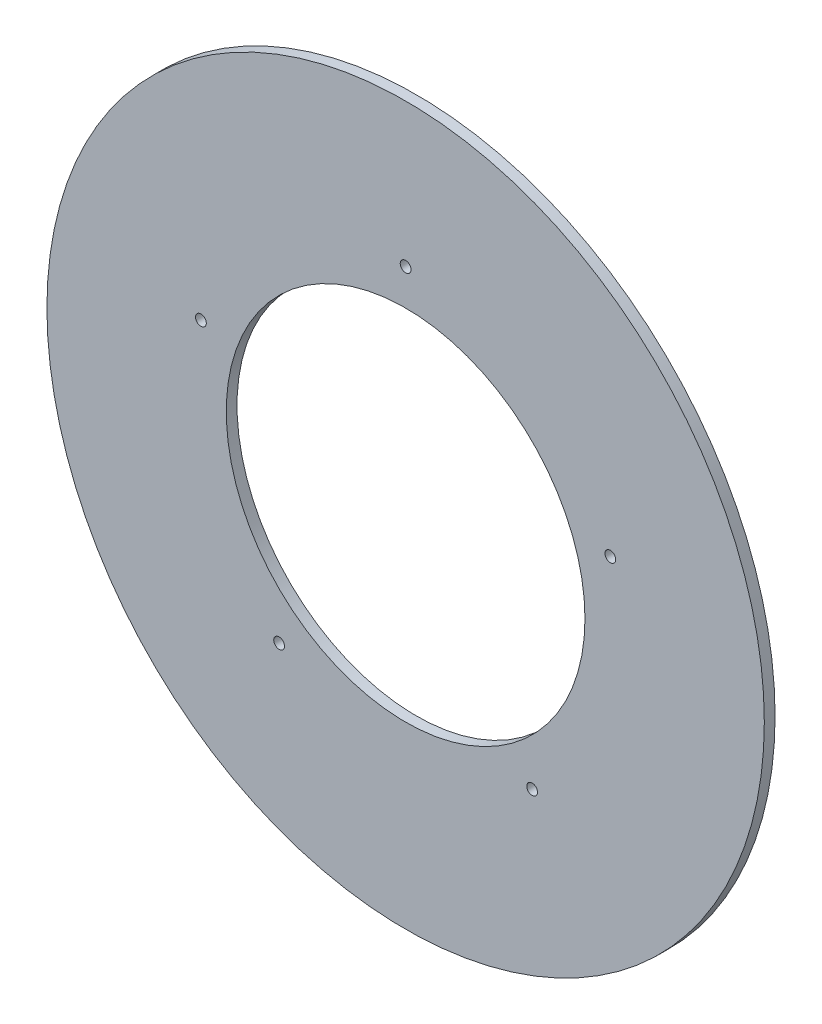
ISO-10303-21;
HEADER;
FILE_DESCRIPTION(('STEP AP214'),'2;1');
FILE_NAME('part.step','',(''),(''),'','','');
FILE_SCHEMA(('AUTOMOTIVE_DESIGN { 1 0 10303 214 1 1 1 1 }'));
ENDSEC;
DATA;
#1=APPLICATION_CONTEXT('core data for automotive mechanical design processes');
#2=APPLICATION_PROTOCOL_DEFINITION('international standard','automotive_design',2000,#1);
#3=PRODUCT_CONTEXT('',#1,'mechanical');
#4=PRODUCT('Part','Part','',(#3));
#5=PRODUCT_RELATED_PRODUCT_CATEGORY('part','',(#4));
#6=PRODUCT_DEFINITION_FORMATION('','',#4);
#7=PRODUCT_DEFINITION_CONTEXT('part definition',#1,'design');
#8=PRODUCT_DEFINITION('design','',#6,#7);
#9=PRODUCT_DEFINITION_SHAPE('','',#8);
#10=(LENGTH_UNIT() NAMED_UNIT(*) SI_UNIT(.MILLI.,.METRE.));
#11=(NAMED_UNIT(*) PLANE_ANGLE_UNIT() SI_UNIT($,.RADIAN.));
#12=(NAMED_UNIT(*) SI_UNIT($,.STERADIAN.) SOLID_ANGLE_UNIT());
#13=UNCERTAINTY_MEASURE_WITH_UNIT(LENGTH_MEASURE(1.E-05),#10,'distance_accuracy_value','');
#14=(GEOMETRIC_REPRESENTATION_CONTEXT(3) GLOBAL_UNCERTAINTY_ASSIGNED_CONTEXT((#13)) GLOBAL_UNIT_ASSIGNED_CONTEXT((#10,
#11,#12)) REPRESENTATION_CONTEXT('',''));
#15=CARTESIAN_POINT('',(0.,0.,0.));
#16=DIRECTION('',(0.,0.,1.));
#17=DIRECTION('',(1.,0.,0.));
#18=AXIS2_PLACEMENT_3D('',#15,#16,#17);
#19=CARTESIAN_POINT('',(0.,0.,1.5));
#20=DIRECTION('',(0.,0.,1.));
#21=DIRECTION('',(1.,0.,0.));
#22=AXIS2_PLACEMENT_3D('',#19,#20,#21);
#23=PLANE('',#22);
#24=CARTESIAN_POINT('',(0.,30.,1.5));
#25=DIRECTION('',(0.,0.,1.));
#26=DIRECTION('',(1.,0.,0.));
#27=AXIS2_PLACEMENT_3D('',#24,#25,#26);
#28=CIRCLE('',#27,0.75);
#29=CARTESIAN_POINT('',(0.75,30.,1.5));
#30=VERTEX_POINT('',#29);
#31=EDGE_CURVE('E75',#30,#30,#28,.T.);
#32=ORIENTED_EDGE('',*,*,#31,.F.);
#33=EDGE_LOOP('',(#32));
#34=FACE_BOUND('',#33,.T.);
#35=CARTESIAN_POINT('',(28.5316954888546,9.27050983124842,1.5));
#36=DIRECTION('',(0.,0.,1.));
#37=DIRECTION('',(1.,0.,0.));
#38=AXIS2_PLACEMENT_3D('',#35,#36,#37);
#39=CIRCLE('',#38,0.750000000000002);
#40=CARTESIAN_POINT('',(29.2816954888546,9.27050983124842,1.5));
#41=VERTEX_POINT('',#40);
#42=EDGE_CURVE('E69',#41,#41,#39,.T.);
#43=ORIENTED_EDGE('',*,*,#42,.F.);
#44=EDGE_LOOP('',(#43));
#45=FACE_BOUND('',#44,.T.);
#46=CARTESIAN_POINT('',(17.6335575687742,-24.2705098312484,1.5));
#47=DIRECTION('',(0.,0.,1.));
#48=DIRECTION('',(1.,0.,0.));
#49=AXIS2_PLACEMENT_3D('',#46,#47,#48);
#50=CIRCLE('',#49,0.750000000000002);
#51=CARTESIAN_POINT('',(18.3835575687742,-24.2705098312484,1.5));
#52=VERTEX_POINT('',#51);
#53=EDGE_CURVE('E63',#52,#52,#50,.T.);
#54=ORIENTED_EDGE('',*,*,#53,.F.);
#55=EDGE_LOOP('',(#54));
#56=FACE_BOUND('',#55,.T.);
#57=CARTESIAN_POINT('',(-17.6335575687742,-24.2705098312484,1.5));
#58=DIRECTION('',(0.,0.,1.));
#59=DIRECTION('',(1.,0.,0.));
#60=AXIS2_PLACEMENT_3D('',#57,#58,#59);
#61=CIRCLE('',#60,0.750000000000002);
#62=CARTESIAN_POINT('',(-16.8835575687742,-24.2705098312484,1.5));
#63=VERTEX_POINT('',#62);
#64=EDGE_CURVE('E57',#63,#63,#61,.T.);
#65=ORIENTED_EDGE('',*,*,#64,.F.);
#66=EDGE_LOOP('',(#65));
#67=FACE_BOUND('',#66,.T.);
#68=CARTESIAN_POINT('',(-28.5316954888546,9.27050983124842,1.5));
#69=DIRECTION('',(0.,0.,1.));
#70=DIRECTION('',(1.,0.,0.));
#71=AXIS2_PLACEMENT_3D('',#68,#69,#70);
#72=CIRCLE('',#71,0.750000000000002);
#73=CARTESIAN_POINT('',(-27.7816954888546,9.27050983124842,1.5));
#74=VERTEX_POINT('',#73);
#75=EDGE_CURVE('E51',#74,#74,#72,.T.);
#76=ORIENTED_EDGE('',*,*,#75,.F.);
#77=EDGE_LOOP('',(#76));
#78=FACE_BOUND('',#77,.T.);
#79=CARTESIAN_POINT('',(0.,0.,1.5));
#80=DIRECTION('',(0.,0.,1.));
#81=DIRECTION('',(1.,0.,0.));
#82=AXIS2_PLACEMENT_3D('',#79,#80,#81);
#83=CIRCLE('',#82,50.);
#84=CARTESIAN_POINT('',(50.,0.,1.5));
#85=VERTEX_POINT('',#84);
#86=EDGE_CURVE('E10',#85,#85,#83,.T.);
#87=ORIENTED_EDGE('',*,*,#86,.T.);
#88=EDGE_LOOP('',(#87));
#89=FACE_BOUND('',#88,.T.);
#90=CARTESIAN_POINT('',(0.,0.,1.5));
#91=DIRECTION('',(0.,0.,1.));
#92=DIRECTION('',(1.,0.,0.));
#93=AXIS2_PLACEMENT_3D('',#90,#91,#92);
#94=CIRCLE('',#93,25.);
#95=CARTESIAN_POINT('',(25.,0.,1.5));
#96=VERTEX_POINT('',#95);
#97=EDGE_CURVE('E43',#96,#96,#94,.T.);
#98=ORIENTED_EDGE('',*,*,#97,.F.);
#99=EDGE_LOOP('',(#98));
#100=FACE_BOUND('',#99,.T.);
#101=ADVANCED_FACE('F32',(#34,#45,#56,#67,#78,#89,#100),#23,.T.);
#102=CARTESIAN_POINT('',(0.,0.,0.));
#103=DIRECTION('',(0.,0.,1.));
#104=DIRECTION('',(1.,0.,0.));
#105=AXIS2_PLACEMENT_3D('',#102,#103,#104);
#106=PLANE('',#105);
#107=CARTESIAN_POINT('',(0.,30.,0.));
#108=DIRECTION('',(0.,0.,1.));
#109=DIRECTION('',(1.,0.,0.));
#110=AXIS2_PLACEMENT_3D('',#107,#108,#109);
#111=CIRCLE('',#110,0.75);
#112=CARTESIAN_POINT('',(0.75,30.,0.));
#113=VERTEX_POINT('',#112);
#114=EDGE_CURVE('E48',#113,#113,#111,.T.);
#115=ORIENTED_EDGE('',*,*,#114,.T.);
#116=EDGE_LOOP('',(#115));
#117=FACE_BOUND('',#116,.T.);
#118=CARTESIAN_POINT('',(28.5316954888546,9.27050983124842,0.));
#119=DIRECTION('',(0.,0.,1.));
#120=DIRECTION('',(1.,0.,0.));
#121=AXIS2_PLACEMENT_3D('',#118,#119,#120);
#122=CIRCLE('',#121,0.750000000000002);
#123=CARTESIAN_POINT('',(29.2816954888546,9.27050983124842,0.));
#124=VERTEX_POINT('',#123);
#125=EDGE_CURVE('E72',#124,#124,#122,.T.);
#126=ORIENTED_EDGE('',*,*,#125,.T.);
#127=EDGE_LOOP('',(#126));
#128=FACE_BOUND('',#127,.T.);
#129=CARTESIAN_POINT('',(17.6335575687742,-24.2705098312484,0.));
#130=DIRECTION('',(0.,0.,1.));
#131=DIRECTION('',(1.,0.,0.));
#132=AXIS2_PLACEMENT_3D('',#129,#130,#131);
#133=CIRCLE('',#132,0.750000000000002);
#134=CARTESIAN_POINT('',(18.3835575687742,-24.2705098312484,0.));
#135=VERTEX_POINT('',#134);
#136=EDGE_CURVE('E66',#135,#135,#133,.T.);
#137=ORIENTED_EDGE('',*,*,#136,.T.);
#138=EDGE_LOOP('',(#137));
#139=FACE_BOUND('',#138,.T.);
#140=CARTESIAN_POINT('',(-17.6335575687742,-24.2705098312484,0.));
#141=DIRECTION('',(0.,0.,1.));
#142=DIRECTION('',(1.,0.,0.));
#143=AXIS2_PLACEMENT_3D('',#140,#141,#142);
#144=CIRCLE('',#143,0.750000000000002);
#145=CARTESIAN_POINT('',(-16.8835575687742,-24.2705098312484,0.));
#146=VERTEX_POINT('',#145);
#147=EDGE_CURVE('E60',#146,#146,#144,.T.);
#148=ORIENTED_EDGE('',*,*,#147,.T.);
#149=EDGE_LOOP('',(#148));
#150=FACE_BOUND('',#149,.T.);
#151=CARTESIAN_POINT('',(-28.5316954888546,9.27050983124842,0.));
#152=DIRECTION('',(0.,0.,1.));
#153=DIRECTION('',(1.,0.,0.));
#154=AXIS2_PLACEMENT_3D('',#151,#152,#153);
#155=CIRCLE('',#154,0.750000000000002);
#156=CARTESIAN_POINT('',(-27.7816954888546,9.27050983124842,0.));
#157=VERTEX_POINT('',#156);
#158=EDGE_CURVE('E54',#157,#157,#155,.T.);
#159=ORIENTED_EDGE('',*,*,#158,.T.);
#160=EDGE_LOOP('',(#159));
#161=FACE_BOUND('',#160,.T.);
#162=CARTESIAN_POINT('',(0.,0.,0.));
#163=DIRECTION('',(0.,0.,1.));
#164=DIRECTION('',(1.,0.,0.));
#165=AXIS2_PLACEMENT_3D('',#162,#163,#164);
#166=CIRCLE('',#165,50.);
#167=CARTESIAN_POINT('',(50.,0.,0.));
#168=VERTEX_POINT('',#167);
#169=EDGE_CURVE('E36',#168,#168,#166,.T.);
#170=ORIENTED_EDGE('',*,*,#169,.F.);
#171=EDGE_LOOP('',(#170));
#172=FACE_BOUND('',#171,.T.);
#173=CARTESIAN_POINT('',(0.,0.,0.));
#174=DIRECTION('',(0.,0.,1.));
#175=DIRECTION('',(1.,0.,0.));
#176=AXIS2_PLACEMENT_3D('',#173,#174,#175);
#177=CIRCLE('',#176,25.);
#178=CARTESIAN_POINT('',(25.,0.,0.));
#179=VERTEX_POINT('',#178);
#180=EDGE_CURVE('E45',#179,#179,#177,.T.);
#181=ORIENTED_EDGE('',*,*,#180,.T.);
#182=EDGE_LOOP('',(#181));
#183=FACE_BOUND('',#182,.T.);
#184=ADVANCED_FACE('F81',(#117,#128,#139,#150,#161,#172,#183),#106,.F.);
#185=CARTESIAN_POINT('',(0.,0.,1.5));
#186=DIRECTION('',(0.,0.,-1.));
#187=DIRECTION('',(-1.,0.,0.));
#188=AXIS2_PLACEMENT_3D('',#185,#186,#187);
#189=CYLINDRICAL_SURFACE('',#188,50.);
#190=ORIENTED_EDGE('',*,*,#86,.F.);
#191=EDGE_LOOP('',(#190));
#192=FACE_BOUND('',#191,.T.);
#193=ORIENTED_EDGE('',*,*,#169,.T.);
#194=EDGE_LOOP('',(#193));
#195=FACE_BOUND('',#194,.T.);
#196=ADVANCED_FACE('F34',(#192,#195),#189,.T.);
#197=CARTESIAN_POINT('',(0.,0.,1.5));
#198=DIRECTION('',(0.,0.,-1.));
#199=DIRECTION('',(-1.,0.,0.));
#200=AXIS2_PLACEMENT_3D('',#197,#198,#199);
#201=CYLINDRICAL_SURFACE('',#200,25.);
#202=ORIENTED_EDGE('',*,*,#97,.T.);
#203=EDGE_LOOP('',(#202));
#204=FACE_BOUND('',#203,.T.);
#205=ORIENTED_EDGE('',*,*,#180,.F.);
#206=EDGE_LOOP('',(#205));
#207=FACE_BOUND('',#206,.T.);
#208=ADVANCED_FACE('F104',(#204,#207),#201,.F.);
#209=CARTESIAN_POINT('',(-28.5316954888546,9.27050983124842,0.));
#210=DIRECTION('',(0.,0.,1.));
#211=DIRECTION('',(1.,0.,0.));
#212=AXIS2_PLACEMENT_3D('',#209,#210,#211);
#213=CYLINDRICAL_SURFACE('',#212,0.750000000000002);
#214=ORIENTED_EDGE('',*,*,#158,.F.);
#215=EDGE_LOOP('',(#214));
#216=FACE_BOUND('',#215,.T.);
#217=ORIENTED_EDGE('',*,*,#75,.T.);
#218=EDGE_LOOP('',(#217));
#219=FACE_BOUND('',#218,.T.);
#220=ADVANCED_FACE('F107',(#216,#219),#213,.F.);
#221=CARTESIAN_POINT('',(-17.6335575687742,-24.2705098312484,0.));
#222=DIRECTION('',(0.,0.,1.));
#223=DIRECTION('',(1.,0.,0.));
#224=AXIS2_PLACEMENT_3D('',#221,#222,#223);
#225=CYLINDRICAL_SURFACE('',#224,0.750000000000002);
#226=ORIENTED_EDGE('',*,*,#147,.F.);
#227=EDGE_LOOP('',(#226));
#228=FACE_BOUND('',#227,.T.);
#229=ORIENTED_EDGE('',*,*,#64,.T.);
#230=EDGE_LOOP('',(#229));
#231=FACE_BOUND('',#230,.T.);
#232=ADVANCED_FACE('F119',(#228,#231),#225,.F.);
#233=CARTESIAN_POINT('',(17.6335575687742,-24.2705098312484,0.));
#234=DIRECTION('',(0.,0.,1.));
#235=DIRECTION('',(1.,0.,0.));
#236=AXIS2_PLACEMENT_3D('',#233,#234,#235);
#237=CYLINDRICAL_SURFACE('',#236,0.750000000000002);
#238=ORIENTED_EDGE('',*,*,#136,.F.);
#239=EDGE_LOOP('',(#238));
#240=FACE_BOUND('',#239,.T.);
#241=ORIENTED_EDGE('',*,*,#53,.T.);
#242=EDGE_LOOP('',(#241));
#243=FACE_BOUND('',#242,.T.);
#244=ADVANCED_FACE('F123',(#240,#243),#237,.F.);
#245=CARTESIAN_POINT('',(28.5316954888546,9.27050983124842,0.));
#246=DIRECTION('',(0.,0.,1.));
#247=DIRECTION('',(1.,0.,0.));
#248=AXIS2_PLACEMENT_3D('',#245,#246,#247);
#249=CYLINDRICAL_SURFACE('',#248,0.750000000000002);
#250=ORIENTED_EDGE('',*,*,#125,.F.);
#251=EDGE_LOOP('',(#250));
#252=FACE_BOUND('',#251,.T.);
#253=ORIENTED_EDGE('',*,*,#42,.T.);
#254=EDGE_LOOP('',(#253));
#255=FACE_BOUND('',#254,.T.);
#256=ADVANCED_FACE('F87',(#252,#255),#249,.F.);
#257=CARTESIAN_POINT('',(0.,30.,0.));
#258=DIRECTION('',(0.,0.,1.));
#259=DIRECTION('',(1.,0.,0.));
#260=AXIS2_PLACEMENT_3D('',#257,#258,#259);
#261=CYLINDRICAL_SURFACE('',#260,0.75);
#262=ORIENTED_EDGE('',*,*,#114,.F.);
#263=EDGE_LOOP('',(#262));
#264=FACE_BOUND('',#263,.T.);
#265=ORIENTED_EDGE('',*,*,#31,.T.);
#266=EDGE_LOOP('',(#265));
#267=FACE_BOUND('',#266,.T.);
#268=ADVANCED_FACE('F84',(#264,#267),#261,.F.);
#269=CLOSED_SHELL('',(#101,#184,#196,#208,#220,#232,#244,#256,#268));
#270=MANIFOLD_SOLID_BREP('B2',#269);
#271=ADVANCED_BREP_SHAPE_REPRESENTATION('',(#18,#270),#14);
#272=SHAPE_DEFINITION_REPRESENTATION(#9,#271);
ENDSEC;
END-ISO-10303-21;
